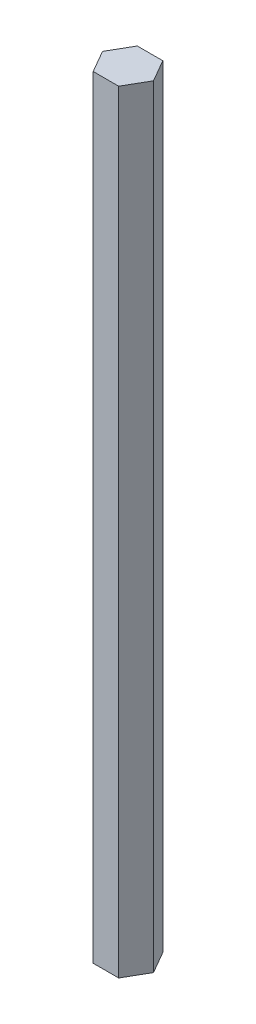
ISO-10303-21;
HEADER;
FILE_DESCRIPTION(('STEP AP214'),'2;1');
FILE_NAME('part.step','',(''),(''),'','','');
FILE_SCHEMA(('AUTOMOTIVE_DESIGN { 1 0 10303 214 1 1 1 1 }'));
ENDSEC;
DATA;
#1=APPLICATION_CONTEXT('core data for automotive mechanical design processes');
#2=APPLICATION_PROTOCOL_DEFINITION('international standard','automotive_design',2000,#1);
#3=PRODUCT_CONTEXT('',#1,'mechanical');
#4=PRODUCT('Part','Part','',(#3));
#5=PRODUCT_RELATED_PRODUCT_CATEGORY('part','',(#4));
#6=PRODUCT_DEFINITION_FORMATION('','',#4);
#7=PRODUCT_DEFINITION_CONTEXT('part definition',#1,'design');
#8=PRODUCT_DEFINITION('design','',#6,#7);
#9=PRODUCT_DEFINITION_SHAPE('','',#8);
#10=(LENGTH_UNIT() NAMED_UNIT(*) SI_UNIT(.MILLI.,.METRE.));
#11=(NAMED_UNIT(*) PLANE_ANGLE_UNIT() SI_UNIT($,.RADIAN.));
#12=(NAMED_UNIT(*) SI_UNIT($,.STERADIAN.) SOLID_ANGLE_UNIT());
#13=UNCERTAINTY_MEASURE_WITH_UNIT(LENGTH_MEASURE(1.E-05),#10,'distance_accuracy_value','');
#14=(GEOMETRIC_REPRESENTATION_CONTEXT(3) GLOBAL_UNCERTAINTY_ASSIGNED_CONTEXT((#13)) GLOBAL_UNIT_ASSIGNED_CONTEXT((#10,
#11,#12)) REPRESENTATION_CONTEXT('',''));
#15=CARTESIAN_POINT('',(0.,0.,0.));
#16=DIRECTION('',(0.,0.,1.));
#17=DIRECTION('',(1.,0.,0.));
#18=AXIS2_PLACEMENT_3D('',#15,#16,#17);
#19=CARTESIAN_POINT('',(-3.66617420935412,222.25,6.35));
#20=DIRECTION('',(0.,0.,-1.));
#21=DIRECTION('',(-1.,0.,0.));
#22=AXIS2_PLACEMENT_3D('',#19,#20,#21);
#23=PLANE('',#22);
#24=DIRECTION('',(1.,0.,0.));
#25=VECTOR('',#24,1.);
#26=CARTESIAN_POINT('',(-3.66617420935412,0.,6.35));
#27=LINE('',#26,#25);
#28=CARTESIAN_POINT('',(-3.66617420935412,0.,6.35));
#29=VERTEX_POINT('',#28);
#30=CARTESIAN_POINT('',(3.66617420935412,0.,6.35));
#31=VERTEX_POINT('',#30);
#32=EDGE_CURVE('E121',#29,#31,#27,.T.);
#33=ORIENTED_EDGE('',*,*,#32,.T.);
#34=DIRECTION('',(0.,-1.,0.));
#35=VECTOR('',#34,1.);
#36=CARTESIAN_POINT('',(3.66617420935412,222.25,6.35));
#37=LINE('',#36,#35);
#38=CARTESIAN_POINT('',(3.66617420935412,222.25,6.35));
#39=VERTEX_POINT('',#38);
#40=EDGE_CURVE('E11',#39,#31,#37,.T.);
#41=ORIENTED_EDGE('',*,*,#40,.F.);
#42=DIRECTION('',(1.,0.,0.));
#43=VECTOR('',#42,1.);
#44=CARTESIAN_POINT('',(-3.66617420935412,222.25,6.35));
#45=LINE('',#44,#43);
#46=CARTESIAN_POINT('',(-3.66617420935412,222.25,6.35));
#47=VERTEX_POINT('',#46);
#48=EDGE_CURVE('E131',#47,#39,#45,.T.);
#49=ORIENTED_EDGE('',*,*,#48,.F.);
#50=DIRECTION('',(0.,-1.,0.));
#51=VECTOR('',#50,1.);
#52=CARTESIAN_POINT('',(-3.66617420935412,222.25,6.35));
#53=LINE('',#52,#51);
#54=EDGE_CURVE('E117',#47,#29,#53,.T.);
#55=ORIENTED_EDGE('',*,*,#54,.T.);
#56=EDGE_LOOP('',(#33,#41,#49,#55));
#57=FACE_BOUND('',#56,.T.);
#58=ADVANCED_FACE('F37',(#57),#23,.F.);
#59=CARTESIAN_POINT('',(3.66617420935412,222.25,6.35));
#60=DIRECTION('',(-0.866025403784438,0.,-0.5));
#61=DIRECTION('',(-0.5,0.,0.866025403784439));
#62=AXIS2_PLACEMENT_3D('',#59,#60,#61);
#63=PLANE('',#62);
#64=DIRECTION('',(0.5,0.,-0.866025403784438));
#65=VECTOR('',#64,1.);
#66=CARTESIAN_POINT('',(3.66617420935412,0.,6.35));
#67=LINE('',#66,#65);
#68=CARTESIAN_POINT('',(7.33234841870825,0.,0.));
#69=VERTEX_POINT('',#68);
#70=EDGE_CURVE('E124',#31,#69,#67,.T.);
#71=ORIENTED_EDGE('',*,*,#70,.T.);
#72=DIRECTION('',(0.,-1.,0.));
#73=VECTOR('',#72,1.);
#74=CARTESIAN_POINT('',(7.33234841870825,222.25,0.));
#75=LINE('',#74,#73);
#76=CARTESIAN_POINT('',(7.33234841870825,222.25,0.));
#77=VERTEX_POINT('',#76);
#78=EDGE_CURVE('E45',#77,#69,#75,.T.);
#79=ORIENTED_EDGE('',*,*,#78,.F.);
#80=DIRECTION('',(0.5,0.,-0.866025403784438));
#81=VECTOR('',#80,1.);
#82=CARTESIAN_POINT('',(3.66617420935412,222.25,6.35));
#83=LINE('',#82,#81);
#84=EDGE_CURVE('E90',#39,#77,#83,.T.);
#85=ORIENTED_EDGE('',*,*,#84,.F.);
#86=ORIENTED_EDGE('',*,*,#40,.T.);
#87=EDGE_LOOP('',(#71,#79,#85,#86));
#88=FACE_BOUND('',#87,.T.);
#89=ADVANCED_FACE('F155',(#88),#63,.F.);
#90=CARTESIAN_POINT('',(7.33234841870825,222.25,0.));
#91=DIRECTION('',(-0.866025403784439,0.,0.5));
#92=DIRECTION('',(0.5,0.,0.866025403784439));
#93=AXIS2_PLACEMENT_3D('',#90,#91,#92);
#94=PLANE('',#93);
#95=DIRECTION('',(-0.5,0.,-0.866025403784439));
#96=VECTOR('',#95,1.);
#97=CARTESIAN_POINT('',(7.33234841870825,0.,0.));
#98=LINE('',#97,#96);
#99=CARTESIAN_POINT('',(3.66617420935412,0.,-6.35));
#100=VERTEX_POINT('',#99);
#101=EDGE_CURVE('E126',#69,#100,#98,.T.);
#102=ORIENTED_EDGE('',*,*,#101,.T.);
#103=DIRECTION('',(0.,-1.,0.));
#104=VECTOR('',#103,1.);
#105=CARTESIAN_POINT('',(3.66617420935412,222.25,-6.35));
#106=LINE('',#105,#104);
#107=CARTESIAN_POINT('',(3.66617420935412,222.25,-6.35));
#108=VERTEX_POINT('',#107);
#109=EDGE_CURVE('E112',#108,#100,#106,.T.);
#110=ORIENTED_EDGE('',*,*,#109,.F.);
#111=DIRECTION('',(-0.5,0.,-0.866025403784439));
#112=VECTOR('',#111,1.);
#113=CARTESIAN_POINT('',(7.33234841870825,222.25,0.));
#114=LINE('',#113,#112);
#115=EDGE_CURVE('E103',#77,#108,#114,.T.);
#116=ORIENTED_EDGE('',*,*,#115,.F.);
#117=ORIENTED_EDGE('',*,*,#78,.T.);
#118=EDGE_LOOP('',(#102,#110,#116,#117));
#119=FACE_BOUND('',#118,.T.);
#120=ADVANCED_FACE('F137',(#119),#94,.F.);
#121=CARTESIAN_POINT('',(3.66617420935412,222.25,-6.35));
#122=DIRECTION('',(0.,0.,1.));
#123=DIRECTION('',(1.,0.,0.));
#124=AXIS2_PLACEMENT_3D('',#121,#122,#123);
#125=PLANE('',#124);
#126=DIRECTION('',(-1.,0.,0.));
#127=VECTOR('',#126,1.);
#128=CARTESIAN_POINT('',(3.66617420935412,0.,-6.35));
#129=LINE('',#128,#127);
#130=CARTESIAN_POINT('',(-3.66617420935412,0.,-6.35));
#131=VERTEX_POINT('',#130);
#132=EDGE_CURVE('E111',#100,#131,#129,.T.);
#133=ORIENTED_EDGE('',*,*,#132,.T.);
#134=DIRECTION('',(0.,-1.,0.));
#135=VECTOR('',#134,1.);
#136=CARTESIAN_POINT('',(-3.66617420935412,222.25,-6.35));
#137=LINE('',#136,#135);
#138=CARTESIAN_POINT('',(-3.66617420935412,222.25,-6.35));
#139=VERTEX_POINT('',#138);
#140=EDGE_CURVE('E108',#139,#131,#137,.T.);
#141=ORIENTED_EDGE('',*,*,#140,.F.);
#142=DIRECTION('',(-1.,0.,0.));
#143=VECTOR('',#142,1.);
#144=CARTESIAN_POINT('',(3.66617420935412,222.25,-6.35));
#145=LINE('',#144,#143);
#146=EDGE_CURVE('E97',#108,#139,#145,.T.);
#147=ORIENTED_EDGE('',*,*,#146,.F.);
#148=ORIENTED_EDGE('',*,*,#109,.T.);
#149=EDGE_LOOP('',(#133,#141,#147,#148));
#150=FACE_BOUND('',#149,.T.);
#151=ADVANCED_FACE('F109',(#150),#125,.F.);
#152=CARTESIAN_POINT('',(-3.66617420935412,222.25,-6.35));
#153=DIRECTION('',(0.866025403784439,0.,0.5));
#154=DIRECTION('',(0.5,0.,-0.866025403784439));
#155=AXIS2_PLACEMENT_3D('',#152,#153,#154);
#156=PLANE('',#155);
#157=DIRECTION('',(-0.5,0.,0.866025403784439));
#158=VECTOR('',#157,1.);
#159=CARTESIAN_POINT('',(-3.66617420935412,0.,-6.35));
#160=LINE('',#159,#158);
#161=CARTESIAN_POINT('',(-7.33234841870824,0.,0.));
#162=VERTEX_POINT('',#161);
#163=EDGE_CURVE('E76',#131,#162,#160,.T.);
#164=ORIENTED_EDGE('',*,*,#163,.T.);
#165=DIRECTION('',(0.,-1.,0.));
#166=VECTOR('',#165,1.);
#167=CARTESIAN_POINT('',(-7.33234841870824,222.25,0.));
#168=LINE('',#167,#166);
#169=CARTESIAN_POINT('',(-7.33234841870824,222.25,0.));
#170=VERTEX_POINT('',#169);
#171=EDGE_CURVE('E113',#170,#162,#168,.T.);
#172=ORIENTED_EDGE('',*,*,#171,.F.);
#173=DIRECTION('',(-0.5,0.,0.866025403784439));
#174=VECTOR('',#173,1.);
#175=CARTESIAN_POINT('',(-3.66617420935412,222.25,-6.35));
#176=LINE('',#175,#174);
#177=EDGE_CURVE('E101',#139,#170,#176,.T.);
#178=ORIENTED_EDGE('',*,*,#177,.F.);
#179=ORIENTED_EDGE('',*,*,#140,.T.);
#180=EDGE_LOOP('',(#164,#172,#178,#179));
#181=FACE_BOUND('',#180,.T.);
#182=ADVANCED_FACE('F115',(#181),#156,.F.);
#183=CARTESIAN_POINT('',(-7.33234841870824,222.25,0.));
#184=DIRECTION('',(0.866025403784439,0.,-0.5));
#185=DIRECTION('',(-0.5,0.,-0.866025403784439));
#186=AXIS2_PLACEMENT_3D('',#183,#184,#185);
#187=PLANE('',#186);
#188=DIRECTION('',(0.5,0.,0.866025403784439));
#189=VECTOR('',#188,1.);
#190=CARTESIAN_POINT('',(-7.33234841870824,0.,0.));
#191=LINE('',#190,#189);
#192=EDGE_CURVE('E82',#162,#29,#191,.T.);
#193=ORIENTED_EDGE('',*,*,#192,.T.);
#194=ORIENTED_EDGE('',*,*,#54,.F.);
#195=DIRECTION('',(0.5,0.,0.866025403784439));
#196=VECTOR('',#195,1.);
#197=CARTESIAN_POINT('',(-7.33234841870824,222.25,0.));
#198=LINE('',#197,#196);
#199=EDGE_CURVE('E53',#170,#47,#198,.T.);
#200=ORIENTED_EDGE('',*,*,#199,.F.);
#201=ORIENTED_EDGE('',*,*,#171,.T.);
#202=EDGE_LOOP('',(#193,#194,#200,#201));
#203=FACE_BOUND('',#202,.T.);
#204=ADVANCED_FACE('F144',(#203),#187,.F.);
#205=CARTESIAN_POINT('',(0.,222.25,0.));
#206=DIRECTION('',(0.,1.,0.));
#207=DIRECTION('',(0.,0.,1.));
#208=AXIS2_PLACEMENT_3D('',#205,#206,#207);
#209=PLANE('',#208);
#210=ORIENTED_EDGE('',*,*,#48,.T.);
#211=ORIENTED_EDGE('',*,*,#84,.T.);
#212=ORIENTED_EDGE('',*,*,#115,.T.);
#213=ORIENTED_EDGE('',*,*,#146,.T.);
#214=ORIENTED_EDGE('',*,*,#177,.T.);
#215=ORIENTED_EDGE('',*,*,#199,.T.);
#216=EDGE_LOOP('',(#210,#211,#212,#213,#214,#215));
#217=FACE_BOUND('',#216,.T.);
#218=ADVANCED_FACE('F99',(#217),#209,.T.);
#219=CARTESIAN_POINT('',(0.,0.,0.));
#220=DIRECTION('',(0.,1.,0.));
#221=DIRECTION('',(0.,0.,1.));
#222=AXIS2_PLACEMENT_3D('',#219,#220,#221);
#223=PLANE('',#222);
#224=ORIENTED_EDGE('',*,*,#32,.F.);
#225=ORIENTED_EDGE('',*,*,#192,.F.);
#226=ORIENTED_EDGE('',*,*,#163,.F.);
#227=ORIENTED_EDGE('',*,*,#132,.F.);
#228=ORIENTED_EDGE('',*,*,#101,.F.);
#229=ORIENTED_EDGE('',*,*,#70,.F.);
#230=EDGE_LOOP('',(#224,#225,#226,#227,#228,#229));
#231=FACE_BOUND('',#230,.T.);
#232=ADVANCED_FACE('F140',(#231),#223,.F.);
#233=CLOSED_SHELL('',(#58,#89,#120,#151,#182,#204,#218,#232));
#234=MANIFOLD_SOLID_BREP('B2',#233);
#235=ADVANCED_BREP_SHAPE_REPRESENTATION('',(#18,#234),#14);
#236=SHAPE_DEFINITION_REPRESENTATION(#9,#235);
ENDSEC;
END-ISO-10303-21;
